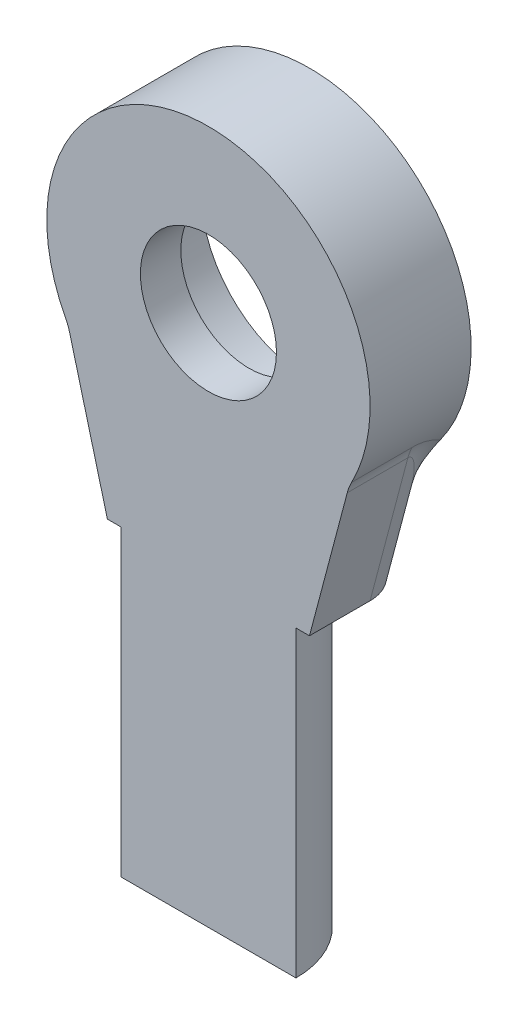
ISO-10303-21;
HEADER;
FILE_DESCRIPTION(('STEP AP214'),'2;1');
FILE_NAME('part.step','',(''),(''),'','','');
FILE_SCHEMA(('AUTOMOTIVE_DESIGN { 1 0 10303 214 1 1 1 1 }'));
ENDSEC;
DATA;
#1=APPLICATION_CONTEXT('core data for automotive mechanical design processes');
#2=APPLICATION_PROTOCOL_DEFINITION('international standard','automotive_design',2000,#1);
#3=PRODUCT_CONTEXT('',#1,'mechanical');
#4=PRODUCT('Part','Part','',(#3));
#5=PRODUCT_RELATED_PRODUCT_CATEGORY('part','',(#4));
#6=PRODUCT_DEFINITION_FORMATION('','',#4);
#7=PRODUCT_DEFINITION_CONTEXT('part definition',#1,'design');
#8=PRODUCT_DEFINITION('design','',#6,#7);
#9=PRODUCT_DEFINITION_SHAPE('','',#8);
#10=(LENGTH_UNIT() NAMED_UNIT(*) SI_UNIT(.MILLI.,.METRE.));
#11=(NAMED_UNIT(*) PLANE_ANGLE_UNIT() SI_UNIT($,.RADIAN.));
#12=(NAMED_UNIT(*) SI_UNIT($,.STERADIAN.) SOLID_ANGLE_UNIT());
#13=UNCERTAINTY_MEASURE_WITH_UNIT(LENGTH_MEASURE(1.E-05),#10,'distance_accuracy_value','');
#14=(GEOMETRIC_REPRESENTATION_CONTEXT(3) GLOBAL_UNCERTAINTY_ASSIGNED_CONTEXT((#13)) GLOBAL_UNIT_ASSIGNED_CONTEXT((#10,
#11,#12)) REPRESENTATION_CONTEXT('',''));
#15=CARTESIAN_POINT('',(0.,0.,0.));
#16=DIRECTION('',(0.,0.,1.));
#17=DIRECTION('',(1.,0.,0.));
#18=AXIS2_PLACEMENT_3D('',#15,#16,#17);
#19=CARTESIAN_POINT('',(448.632229886668,1441.90594011253,-6.));
#20=DIRECTION('',(0.,0.,-1.));
#21=DIRECTION('',(-1.,0.,0.));
#22=AXIS2_PLACEMENT_3D('',#19,#20,#21);
#23=CYLINDRICAL_SURFACE('',#22,8.05000000000052);
#24=CARTESIAN_POINT('',(448.632229886668,1441.90594011253,-6.));
#25=DIRECTION('',(0.,0.,-1.));
#26=DIRECTION('',(-1.,0.,0.));
#27=AXIS2_PLACEMENT_3D('',#24,#25,#26);
#28=CIRCLE('',#27,8.05000000000052);
#29=CARTESIAN_POINT('',(440.582229886668,1441.90594011253,-6.));
#30=VERTEX_POINT('',#29);
#31=EDGE_CURVE('E91',#30,#30,#28,.T.);
#32=ORIENTED_EDGE('',*,*,#31,.F.);
#33=EDGE_LOOP('',(#32));
#34=FACE_BOUND('',#33,.T.);
#35=CARTESIAN_POINT('',(448.632229886668,1441.90594011253,-10.5));
#36=DIRECTION('',(0.,0.,-1.));
#37=DIRECTION('',(-1.,0.,0.));
#38=AXIS2_PLACEMENT_3D('',#35,#36,#37);
#39=CIRCLE('',#38,8.05000000000052);
#40=CARTESIAN_POINT('',(440.582229886668,1441.90594011253,-10.5));
#41=VERTEX_POINT('',#40);
#42=EDGE_CURVE('E139',#41,#41,#39,.F.);
#43=ORIENTED_EDGE('',*,*,#42,.F.);
#44=EDGE_LOOP('',(#43));
#45=FACE_BOUND('',#44,.T.);
#46=ADVANCED_FACE('F16',(#34,#45),#23,.F.);
#47=CARTESIAN_POINT('',(453.028905405185,1424.90594011253,-7.49999999999988));
#48=DIRECTION('',(0.255892560316815,0.966705227861371,0.));
#49=DIRECTION('',(-0.966705227861371,0.255892560316815,0.));
#50=AXIS2_PLACEMENT_3D('',#47,#48,#49);
#51=CYLINDRICAL_SURFACE('',#50,3.00000000000003);
#52=CARTESIAN_POINT('',(453.028905405185,1424.90594011253,-7.49999999999988));
#53=DIRECTION('',(0.,-1.,0.));
#54=DIRECTION('',(1.,0.,-2.79611724719762E-13));
#55=AXIS2_PLACEMENT_3D('',#52,#53,#54);
#56=ELLIPSE('',#55,3.10332448148325,3.00000000000003);
#57=CARTESIAN_POINT('',(453.028905405185,1424.90594011253,-10.5));
#58=VERTEX_POINT('',#57);
#59=CARTESIAN_POINT('',(456.132229886668,1424.90594011253,-7.5000000000002));
#60=VERTEX_POINT('',#59);
#61=EDGE_CURVE('E92',#58,#60,#56,.T.);
#62=ORIENTED_EDGE('',*,*,#61,.F.);
#63=DIRECTION('',(-0.255892560317666,-0.966705227861146,0.));
#64=VECTOR('',#63,1.);
#65=CARTESIAN_POINT('',(453.493858936923,1426.66243123242,-10.5));
#66=LINE('',#65,#64);
#67=CARTESIAN_POINT('',(453.493858936923,1426.66243123242,-10.5));
#68=VERTEX_POINT('',#67);
#69=EDGE_CURVE('E142',#68,#58,#66,.T.);
#70=ORIENTED_EDGE('',*,*,#69,.F.);
#71=CARTESIAN_POINT('',(458.937208448978,1435.50252579237,-7.50000000000044));
#72=CARTESIAN_POINT('',(458.937208448978,1435.50252579237,-7.57651101578004));
#73=CARTESIAN_POINT('',(458.915314342587,1435.44347128536,-7.72910936543949));
#74=CARTESIAN_POINT('',(458.805179282937,1435.15088177023,-8.00502900571239));
#75=CARTESIAN_POINT('',(458.599112538425,1434.62252174929,-8.29806035858928));
#76=CARTESIAN_POINT('',(458.305288655624,1433.91631812947,-8.6050636014635));
#77=CARTESIAN_POINT('',(457.868090404801,1432.93346857883,-8.9788104154463));
#78=CARTESIAN_POINT('',(457.256285892257,1431.69228990232,-9.39636612313964));
#79=CARTESIAN_POINT('',(456.43165446515,1430.24828185882,-9.83085979614496));
#80=CARTESIAN_POINT('',(455.521222224728,1428.88896615841,-10.1854207713805));
#81=CARTESIAN_POINT('',(454.535311734702,1427.66148625712,-10.4333627874454));
#82=CARTESIAN_POINT('',(453.841561273141,1426.96746358986,-10.5));
#83=CARTESIAN_POINT('',(453.493858936923,1426.66243123242,-10.5));
#84=B_SPLINE_CURVE_WITH_KNOTS('',3,(#71,#72,#73,#74,#75,#76,#77,#78,#79,#80,#81,#82,#83),
.UNSPECIFIED.,.F.,.F.,(4,1,1,1,1,1,1,1,1,1,4),(52.8653565728212,53.4009336832801,
53.936510793739,55.0076650146569,56.0788192355747,57.1499734564925,59.2922818983282,
61.4345903401639,63.5768987819995,65.7192072238352,67.8615156656709),.UNSPECIFIED.);
#85=CARTESIAN_POINT('',(458.937208448979,1435.50252579237,-7.50000000000035));
#86=VERTEX_POINT('',#85);
#87=EDGE_CURVE('E149',#86,#68,#84,.T.);
#88=ORIENTED_EDGE('',*,*,#87,.F.);
#89=DIRECTION('',(0.255892560316388,0.966705227861484,0.));
#90=VECTOR('',#89,1.);
#91=CARTESIAN_POINT('',(457.534719167824,1430.20423295245,-7.50000000000047));
#92=LINE('',#91,#90);
#93=EDGE_CURVE('E102',#60,#86,#92,.T.);
#94=ORIENTED_EDGE('',*,*,#93,.F.);
#95=EDGE_LOOP('',(#62,#70,#88,#94));
#96=FACE_BOUND('',#95,.T.);
#97=ADVANCED_FACE('F370',(#96),#51,.T.);
#98=CARTESIAN_POINT('',(462.804029360512,1434.47895555107,-7.50000000000046));
#99=DIRECTION('',(0.,0.,1.));
#100=DIRECTION('',(1.,0.,0.));
#101=AXIS2_PLACEMENT_3D('',#98,#99,#100);
#102=CYLINDRICAL_SURFACE('',#101,4.00000000009279);
#103=CARTESIAN_POINT('',(462.804029360512,1434.47895555107,-7.50000000000044));
#104=DIRECTION('',(0.,0.,1.));
#105=DIRECTION('',(1.,0.,0.));
#106=AXIS2_PLACEMENT_3D('',#103,#104,#105);
#107=CIRCLE('',#106,4.00000000009279);
#108=CARTESIAN_POINT('',(459.261079491986,1436.33570169146,-7.50000000000064));
#109=VERTEX_POINT('',#108);
#110=EDGE_CURVE('E147',#109,#86,#107,.T.);
#111=ORIENTED_EDGE('',*,*,#110,.F.);
#112=DIRECTION('',(0.,0.,-1.));
#113=VECTOR('',#112,1.);
#114=CARTESIAN_POINT('',(459.261079491986,1436.33570169146,-6.7875));
#115=LINE('',#114,#113);
#116=CARTESIAN_POINT('',(459.261079491988,1436.33570169146,-3.));
#117=VERTEX_POINT('',#116);
#118=EDGE_CURVE('E266',#117,#109,#115,.T.);
#119=ORIENTED_EDGE('',*,*,#118,.F.);
#120=CARTESIAN_POINT('',(462.804029360512,1434.47895555107,-3.));
#121=DIRECTION('',(0.,0.,1.));
#122=DIRECTION('',(1.,0.,0.));
#123=AXIS2_PLACEMENT_3D('',#120,#121,#122);
#124=CIRCLE('',#123,4.00000000009279);
#125=CARTESIAN_POINT('',(458.937208448977,1435.50252579236,-3.));
#126=VERTEX_POINT('',#125);
#127=EDGE_CURVE('E20',#117,#126,#124,.T.);
#128=ORIENTED_EDGE('',*,*,#127,.T.);
#129=DIRECTION('',(-2.22044604925008E-13,0.,1.));
#130=VECTOR('',#129,1.);
#131=CARTESIAN_POINT('',(458.937208448979,1435.50252579237,-5.25000000000023));
#132=LINE('',#131,#130);
#133=EDGE_CURVE('E105',#86,#126,#132,.T.);
#134=ORIENTED_EDGE('',*,*,#133,.F.);
#135=EDGE_LOOP('',(#111,#119,#128,#134));
#136=FACE_BOUND('',#135,.T.);
#137=ADVANCED_FACE('F196',(#136),#102,.F.);
#138=CARTESIAN_POINT('',(459.261079491985,1436.33570169146,-7.50000000000101));
#139=CARTESIAN_POINT('',(459.261079491985,1436.33570169146,-7.6785257034887));
#140=CARTESIAN_POINT('',(459.238806925253,1436.29295986657,-8.03458851936219));
#141=CARTESIAN_POINT('',(459.125660976251,1436.08160307988,-8.67840101333092));
#142=CARTESIAN_POINT('',(458.909239462533,1435.70171080235,-9.36214083671051));
#143=CARTESIAN_POINT('',(458.588983029128,1435.19849916665,-10.0784817367493));
#144=CARTESIAN_POINT('',(458.095644393189,1434.50515493104,-10.9505576360434));
#145=CARTESIAN_POINT('',(457.372081759395,1433.64434101908,-11.9248542873265));
#146=CARTESIAN_POINT('',(456.340182588075,1432.67077117495,-12.9386728576728));
#147=CARTESIAN_POINT('',(455.142799745186,1431.78749110444,-13.7659817998884));
#148=CARTESIAN_POINT('',(453.785659782538,1431.03039188013,-14.3445131707061));
#149=CARTESIAN_POINT('',(452.788706194747,1430.63604448776,-14.5));
#150=CARTESIAN_POINT('',(452.27845167436,1430.47330845245,-14.5));
#151=CARTESIAN_POINT('',(459.241279054424,1436.2979194895,-7.50000000000098));
#152=CARTESIAN_POINT('',(459.241279054424,1436.2979194895,-7.67362701770432));
#153=CARTESIAN_POINT('',(459.218527303584,1436.25463205489,-8.01991815393205));
#154=CARTESIAN_POINT('',(459.102959453249,1436.04062899086,-8.6459174031665));
#155=CARTESIAN_POINT('',(458.881947188455,1435.65629704721,-9.31031623135618));
#156=CARTESIAN_POINT('',(458.555135551572,1435.14808448099,-10.0055083434893));
#157=CARTESIAN_POINT('',(458.05234291392,1434.4493487836,-10.8503635647305));
#158=CARTESIAN_POINT('',(457.316763874983,1433.58538495557,-11.790946638831));
#159=CARTESIAN_POINT('',(456.274038700857,1432.61564100248,-12.7624631699717));
#160=CARTESIAN_POINT('',(455.075323489833,1431.74484231416,-13.545320583899));
#161=CARTESIAN_POINT('',(453.734838722947,1431.00811670544,-14.0792009561619));
#162=CARTESIAN_POINT('',(452.768031054394,1430.62949966598,-14.2096053694294));
#163=CARTESIAN_POINT('',(452.27845167436,1430.47330845245,-14.2008006996581));
#164=CARTESIAN_POINT('',(459.18369074823,1436.18362274734,-7.5000000000009));
#165=CARTESIAN_POINT('',(459.18369074823,1436.18362274734,-7.65893095998917));
#166=CARTESIAN_POINT('',(459.159713630999,1436.13856142434,-7.97590904947657));
#167=CARTESIAN_POINT('',(459.037941758815,1435.9159746504,-8.54847060653616));
#168=CARTESIAN_POINT('',(458.805260848445,1435.51688498167,-9.1548541392806));
#169=CARTESIAN_POINT('',(458.461962941206,1434.99111893327,-9.78660881744868));
#170=CARTESIAN_POINT('',(457.935633714869,1434.27169756931,-10.5498046266487));
#171=CARTESIAN_POINT('',(457.17081809454,1433.3899839524,-11.3892700924674));
#172=CARTESIAN_POINT('',(456.10346395943,1432.41755460738,-12.2338838405543));
#173=CARTESIAN_POINT('',(454.906673953089,1431.56539249056,-12.8834002597003));
#174=CARTESIAN_POINT('',(453.617982283633,1430.86777948113,-13.2832947815088));
#175=CARTESIAN_POINT('',(452.738948483568,1430.52100552055,-13.3384311695949));
#176=CARTESIAN_POINT('',(452.30893535147,1430.37772769178,-13.3031780418912));
#177=CARTESIAN_POINT('',(459.096925720413,1435.98866836809,-7.50000000000077));
#178=CARTESIAN_POINT('',(459.096925720413,1435.98866836809,-7.63447513793553));
#179=CARTESIAN_POINT('',(459.071942088017,1435.94013192873,-7.9026740737783));
#180=CARTESIAN_POINT('',(458.945213525226,1435.70035097295,-8.38644400580358));
#181=CARTESIAN_POINT('',(458.703725718513,1435.27043314292,-8.89681480489716));
#182=CARTESIAN_POINT('',(458.34930824006,1434.70409346349,-9.42438216910841));
#183=CARTESIAN_POINT('',(457.809212372483,1433.92932934547,-10.0547648414138));
#184=CARTESIAN_POINT('',(457.032104952352,1432.98051587451,-10.7325702098317));
#185=CARTESIAN_POINT('',(455.968175631682,1431.93607276744,-11.380146116023));
#186=CARTESIAN_POINT('',(454.809344005836,1431.02337460336,-11.8297949720825));
#187=CARTESIAN_POINT('',(453.617171092271,1430.27745055063,-12.0371481416556));
#188=CARTESIAN_POINT('',(452.862035755585,1429.90281795514,-11.9901287285702));
#189=CARTESIAN_POINT('',(452.511065173195,1429.74395499943,-11.9209023061551));
#190=CARTESIAN_POINT('',(459.007979642307,1435.74854433101,-7.50000000000061));
#191=CARTESIAN_POINT('',(459.007979642307,1435.74854433101,-7.60530843814866));
#192=CARTESIAN_POINT('',(458.983512033903,1435.69509039586,-7.8153329029188));
#193=CARTESIAN_POINT('',(458.859754767646,1435.43071332177,-8.19384849654414));
#194=CARTESIAN_POINT('',(458.625430845801,1434.95530830947,-8.59223958983257));
#195=CARTESIAN_POINT('',(458.285131660067,1434.3252637466,-9.0021148433374));
#196=CARTESIAN_POINT('',(457.771528188261,1433.45705191451,-9.48869805797009));
#197=CARTESIAN_POINT('',(457.042039416362,1432.37947124065,-10.0048261350455));
#198=CARTESIAN_POINT('',(456.05864255289,1431.16287267853,-10.4830869459269));
#199=CARTESIAN_POINT('',(455.002266864215,1430.06029286143,-10.7947777223088));
#200=CARTESIAN_POINT('',(453.92962435359,1429.10996819953,-10.908256592212));
#201=CARTESIAN_POINT('',(453.258625706263,1428.59679499299,-10.8398812780348));
#202=CARTESIAN_POINT('',(452.948490390935,1428.37241983661,-10.7732345861429));
#203=CARTESIAN_POINT('',(458.959039261722,1435.58499775162,-7.5000000000005));
#204=CARTESIAN_POINT('',(458.959039261722,1435.58499775162,-7.58606373038768));
#205=CARTESIAN_POINT('',(458.93608838124,1435.52786417434,-7.75771642275943));
#206=CARTESIAN_POINT('',(458.820387455675,1435.24495161224,-8.06750767899078));
#207=CARTESIAN_POINT('',(458.602885051763,1434.73478252942,-8.39485663562652));
#208=CARTESIAN_POINT('',(458.290531262485,1434.0547758529,-8.73434389344203));
#209=CARTESIAN_POINT('',(457.823303346972,1433.11134838935,-9.14192808479234));
#210=CARTESIAN_POINT('',(457.16619528259,1431.92632786601,-9.58484600163962));
#211=CARTESIAN_POINT('',(456.28288292962,1430.55965441085,-10.0195099217717));
#212=CARTESIAN_POINT('',(455.322442631238,1429.2863009091,-10.3402062954241));
#213=CARTESIAN_POINT('',(454.314136189018,1428.14949247183,-10.5203025150832));
#214=CARTESIAN_POINT('',(453.63959977547,1427.51270132203,-10.5277307398779));
#215=CARTESIAN_POINT('',(453.312034435628,1427.23253713138,-10.5000000000001));
#216=CARTESIAN_POINT('',(458.937208448978,1435.50252579237,-7.50000000000044));
#217=CARTESIAN_POINT('',(458.937208448978,1435.50252579237,-7.57651101578004));
#218=CARTESIAN_POINT('',(458.915314342587,1435.44347128536,-7.72910936543949));
#219=CARTESIAN_POINT('',(458.805179282937,1435.15088177023,-8.00502900571239));
#220=CARTESIAN_POINT('',(458.599112538425,1434.62252174929,-8.29806035858928));
#221=CARTESIAN_POINT('',(458.305288655624,1433.91631812947,-8.6050636014635));
#222=CARTESIAN_POINT('',(457.868090404801,1432.93346857883,-8.9788104154463));
#223=CARTESIAN_POINT('',(457.256285892257,1431.69228990232,-9.39636612313964));
#224=CARTESIAN_POINT('',(456.43165446515,1430.24828185882,-9.83085979614496));
#225=CARTESIAN_POINT('',(455.521222224728,1428.88896615841,-10.1854207713805));
#226=CARTESIAN_POINT('',(454.535311734702,1427.66148625712,-10.4333627874454));
#227=CARTESIAN_POINT('',(453.841561273141,1426.96746358986,-10.5));
#228=CARTESIAN_POINT('',(453.493858936923,1426.66243123242,-10.5));
#229=B_SPLINE_SURFACE_WITH_KNOTS('',3,3,((#138,#139,#140,#141,#142,#143,#144,#145,#146,#147,
#148,#149,#150),(#151,#152,#153,#154,#155,#156,#157,#158,#159,#160,#161,#162,#163),(#164,#165,
#166,#167,#168,#169,#170,#171,#172,#173,#174,#175,#176),(#177,#178,#179,#180,#181,#182,#183,
#184,#185,#186,#187,#188,#189),(#190,#191,#192,#193,#194,#195,#196,#197,#198,#199,#200,#201,
#202),(#203,#204,#205,#206,#207,#208,#209,#210,#211,#212,#213,#214,#215),(#216,#217,#218,#219,
#220,#221,#222,#223,#224,#225,#226,#227,#228)),.UNSPECIFIED.,.F.,.F.,.F.,(4,1,1,1,4),(4,1,1,1,1,
1,1,1,1,1,4),(0.,0.142857142857143,0.428571428571429,0.714285714285714,1.),(52.8653565728212,
53.4009336832801,53.936510793739,55.0076650146569,56.0788192355747,57.1499734564925,
59.2922818983282,61.4345903401639,63.5768987819995,65.7192072238352,67.8615156656709),.UNSPECIFIED.);
#230=CARTESIAN_POINT('',(453.493858936923,1426.66243123242,-10.5));
#231=CARTESIAN_POINT('',(453.522105346006,1426.70608186273,-10.4999995182953));
#232=CARTESIAN_POINT('',(453.550180993919,1426.74984251797,-10.4999959425049));
#233=CARTESIAN_POINT('',(453.642446531642,1426.89477844442,-10.4999805900697));
#234=CARTESIAN_POINT('',(453.705968447676,1426.99637947361,-10.4999642004691));
#235=CARTESIAN_POINT('',(453.867975377029,1427.25909280952,-10.4999711568323));
#236=CARTESIAN_POINT('',(453.965526689691,1427.42077874719,-10.500022824165));
#237=CARTESIAN_POINT('',(454.13492556993,1427.70525012403,-10.5000955077368));
#238=CARTESIAN_POINT('',(454.207179001877,1427.82779526526,-10.500120940664));
#239=CARTESIAN_POINT('',(454.342336630919,1428.0592543227,-10.5001647609599));
#240=CARTESIAN_POINT('',(454.405353935134,1428.16810216685,-10.500183623258));
#241=CARTESIAN_POINT('',(454.522431308104,1428.37156968087,-10.5001628664911));
#242=CARTESIAN_POINT('',(454.576563525734,1428.46614789577,-10.5001307221305));
#243=CARTESIAN_POINT('',(454.703335392347,1428.68903542819,-10.5001158087678));
#244=CARTESIAN_POINT('',(454.775762329362,1428.81746573401,-10.500154476476));
#245=CARTESIAN_POINT('',(454.917038815174,1429.06921796472,-10.5002704771452));
#246=CARTESIAN_POINT('',(454.985910648348,1429.19252742669,-10.5003461145386));
#247=CARTESIAN_POINT('',(455.120223209436,1429.43362919679,-10.5004644767362));
#248=CARTESIAN_POINT('',(455.185676189603,1429.55141468054,-10.5005085540911));
#249=CARTESIAN_POINT('',(455.313199276394,1429.78118263594,-10.5005189823216));
#250=CARTESIAN_POINT('',(455.375275408595,1429.89316176652,-10.5004890973613));
#251=CARTESIAN_POINT('',(455.496076500255,1430.11110598904,-10.5003654469334));
#252=CARTESIAN_POINT('',(455.554802170819,1430.2170706892,-10.5002752028483));
#253=CARTESIAN_POINT('',(455.668858064007,1430.42285845231,-10.5001162372076));
#254=CARTESIAN_POINT('',(455.724187920712,1430.52268171724,-10.5000465717409));
#255=CARTESIAN_POINT('',(455.854117902175,1430.75702061413,-10.5000117206911));
#256=CARTESIAN_POINT('',(455.928728954618,1430.89153021195,-10.5000912867856));
#257=CARTESIAN_POINT('',(456.075155995471,1431.15466496488,-10.5002955935951));
#258=CARTESIAN_POINT('',(456.146956833607,1431.28329854165,-10.500418282819));
#259=CARTESIAN_POINT('',(456.287789169762,1431.53437567653,-10.5006075961207));
#260=CARTESIAN_POINT('',(456.356796715375,1431.65683265217,-10.5006765326928));
#261=CARTESIAN_POINT('',(456.492048551229,1431.89534734466,-10.500697029504));
#262=CARTESIAN_POINT('',(456.55826134235,1432.01142290685,-10.5006542089961));
#263=CARTESIAN_POINT('',(456.687876178512,1432.2370542359,-10.500471312623));
#264=CARTESIAN_POINT('',(456.751242108572,1432.34663074157,-10.5003364895545));
#265=CARTESIAN_POINT('',(456.875082121231,1432.55921949561,-10.5001091102972));
#266=CARTESIAN_POINT('',(456.935518119129,1432.66225392638,-10.5000146015409));
#267=CARTESIAN_POINT('',(457.071177017285,1432.89171489952,-10.4999665909133));
#268=CARTESIAN_POINT('',(457.146583316979,1433.01803327061,-10.5000508092148));
#269=CARTESIAN_POINT('',(457.294493083244,1433.26263399698,-10.5001353965373));
#270=CARTESIAN_POINT('',(457.366917228597,1433.38096423409,-10.5001402685713));
#271=CARTESIAN_POINT('',(457.508775309054,1433.60948984633,-10.5000724110858));
#272=CARTESIAN_POINT('',(457.578121036196,1433.71973993182,-10.5000044118589));
#273=CARTESIAN_POINT('',(457.727248686267,1433.95326945671,-10.5000118490129));
#274=CARTESIAN_POINT('',(457.807234466366,1434.07641901765,-10.5001066667763));
#275=CARTESIAN_POINT('',(457.964907855177,1434.31419882832,-10.5001808127569));
#276=CARTESIAN_POINT('',(458.042466356987,1434.42891438057,-10.5001664193267));
#277=CARTESIAN_POINT('',(458.195266473235,1434.64972714443,-10.5000977692696));
#278=CARTESIAN_POINT('',(458.270363027027,1434.75592487171,-10.5000459849736));
#279=CARTESIAN_POINT('',(458.346709872353,1434.86122859093,-10.5000000097309));
#280=B_SPLINE_CURVE_WITH_KNOTS('',3,(#230,#231,#232,#233,#234,#235,#236,#237,#238,#239,#240,
#241,#242,#243,#244,#245,#246,#247,#248,#249,#250,#251,#252,#253,#254,#255,#256,#257,#258,#259,
#260,#261,#262,#263,#264,#265,#266,#267,#268,#269,#270,#271,#272,#273,#274,#275,#276,#277,#278,
#279),.UNSPECIFIED.,.F.,.F.,(4,2,2,2,2,2,2,2,2,2,2,2,2,2,2,2,2,2,2,2,2,2,2,2,4),(0.,
0.155977048153093,0.5154349915053,1.08191622707472,1.50869227849864,1.88601060564265,
2.21293144289384,2.6552631927427,3.07898095006146,3.48323021096299,3.86733298049842,
4.23078183494849,4.57317741670573,5.03462796122675,5.47657481521467,5.89826010760816,
6.29915574533523,6.67889064296059,7.03724240724763,7.4785761535931,7.89477034587601,
8.28549709982398,8.72601218061923,9.14140312498363,9.53158380776322),.UNSPECIFIED.);
#281=CARTESIAN_POINT('',(458.346782337597,1434.86128814228,-10.4999672292394));
#282=VERTEX_POINT('',#281);
#283=EDGE_CURVE('E144',#282,#68,#280,.F.);
#284=CARTESIAN_POINT('',(452.27845167436,1430.47330845245,-14.5));
#285=CARTESIAN_POINT('',(452.788706194747,1430.63604448776,-14.5));
#286=CARTESIAN_POINT('',(453.785659782538,1431.03039188013,-14.3445131707061));
#287=CARTESIAN_POINT('',(455.142799745186,1431.78749110444,-13.7659817998884));
#288=CARTESIAN_POINT('',(456.340182588075,1432.67077117495,-12.9386728576728));
#289=CARTESIAN_POINT('',(457.372081759395,1433.64434101908,-11.9248542873265));
#290=CARTESIAN_POINT('',(458.095644393189,1434.50515493104,-10.9505576360434));
#291=CARTESIAN_POINT('',(458.588983029128,1435.19849916665,-10.0784817367493));
#292=CARTESIAN_POINT('',(458.909239462533,1435.70171080235,-9.36214083671051));
#293=CARTESIAN_POINT('',(459.125660976251,1436.08160307988,-8.67840101333092));
#294=CARTESIAN_POINT('',(459.238806925253,1436.29295986657,-8.03458851936219));
#295=CARTESIAN_POINT('',(459.261079491985,1436.33570169146,-7.6785257034887));
#296=CARTESIAN_POINT('',(459.261079491985,1436.33570169146,-7.50000000000101));
#297=B_SPLINE_CURVE_WITH_KNOTS('',3,(#284,#285,#286,#287,#288,#289,#290,#291,#292,#293,#294,
#295,#296),.UNSPECIFIED.,.F.,.F.,(4,1,1,1,1,1,1,1,1,1,4),(52.8653565728212,55.0076650146569,
57.1499734564926,59.2922818983282,61.4345903401639,63.5768987819996,64.6480530029174,
65.7192072238352,66.7903614447531,67.325938555212,67.8615156656709),.UNSPECIFIED.);
#298=EDGE_CURVE('E124',#109,#282,#297,.F.);
#299=ORIENTED_EDGE('',*,*,#283,.F.);
#300=ORIENTED_EDGE('',*,*,#298,.F.);
#301=ORIENTED_EDGE('',*,*,#110,.T.);
#302=ORIENTED_EDGE('',*,*,#87,.T.);
#303=EDGE_LOOP('',(#299,#300,#301,#302));
#304=FACE_BOUND('',#303,.T.);
#305=ADVANCED_FACE('F194',(#304),#229,.T.);
#306=CARTESIAN_POINT('',(464.686044414996,1424.90594011253,-10.5));
#307=DIRECTION('',(0.,0.,-1.));
#308=DIRECTION('',(-1.,0.,0.));
#309=AXIS2_PLACEMENT_3D('',#306,#307,#308);
#310=PLANE('',#309);
#311=ORIENTED_EDGE('',*,*,#42,.T.);
#312=EDGE_LOOP('',(#311));
#313=FACE_BOUND('',#312,.T.);
#314=DIRECTION('',(0.255892560316351,-0.966705227861494,0.));
#315=VECTOR('',#314,1.);
#316=CARTESIAN_POINT('',(442.731460688046,1430.58807179292,-10.5000000000001));
#317=LINE('',#316,#315);
#318=CARTESIAN_POINT('',(443.770600836414,1426.66243123242,-10.5));
#319=VERTEX_POINT('',#318);
#320=CARTESIAN_POINT('',(444.235554368152,1424.90594011253,-10.5000000000002));
#321=VERTEX_POINT('',#320);
#322=EDGE_CURVE('E277',#319,#321,#317,.T.);
#323=ORIENTED_EDGE('',*,*,#322,.F.);
#324=CARTESIAN_POINT('',(438.917749908672,1434.86122859651,-10.5000000097366));
#325=CARTESIAN_POINT('',(438.994093173196,1434.75592963277,-10.5000458426316));
#326=CARTESIAN_POINT('',(439.069186424741,1434.64973685114,-10.5000985942719));
#327=CARTESIAN_POINT('',(439.221983445105,1434.42892943899,-10.500169241312));
#328=CARTESIAN_POINT('',(439.299542060374,1434.31421422809,-10.5001846624096));
#329=CARTESIAN_POINT('',(439.457218930857,1434.07642958867,-10.5001098568464));
#330=CARTESIAN_POINT('',(439.537207960026,1433.95327477859,-10.500013178896));
#331=CARTESIAN_POINT('',(439.68633107513,1433.71975152927,-10.5000032353528));
#332=CARTESIAN_POINT('',(439.755669269171,1433.60951312729,-10.5000704536233));
#333=CARTESIAN_POINT('',(439.897520255746,1433.38099986138,-10.5001390230407));
#334=CARTESIAN_POINT('',(439.969944739544,1433.26267022424,-10.5001357871288));
#335=CARTESIAN_POINT('',(440.117862268656,1433.01805795299,-10.500052369579));
#336=CARTESIAN_POINT('',(440.193275821453,1432.89172733313,-10.4999675439133));
#337=CARTESIAN_POINT('',(440.328937055961,1432.66226110815,-10.5000138290005));
#338=CARTESIAN_POINT('',(440.389368366994,1432.55923380886,-10.5001073119846));
#339=CARTESIAN_POINT('',(440.513201132468,1432.34665681236,-10.5003338432522));
#340=CARTESIAN_POINT('',(440.576564512694,1432.23708493901,-10.5004689204637));
#341=CARTESIAN_POINT('',(440.706176120873,1432.01146005593,-10.5006525314043));
#342=CARTESIAN_POINT('',(440.772388224934,1431.89538630214,-10.5006958200974));
#343=CARTESIAN_POINT('',(440.907640496037,1431.6568722268,-10.5006762857707));
#344=CARTESIAN_POINT('',(440.976649150812,1431.53441405233,-10.5006078406146));
#345=CARTESIAN_POINT('',(441.117485373573,1431.28333130907,-10.5004192454918));
#346=CARTESIAN_POINT('',(441.189288970729,1431.15469331233,-10.5002967680441));
#347=CARTESIAN_POINT('',(441.335722820807,1430.89154618259,-10.5000922168956));
#348=CARTESIAN_POINT('',(441.410337891857,1430.75702861041,-10.5000121660116));
#349=CARTESIAN_POINT('',(441.540267733788,1430.52268851147,-10.5000462513434));
#350=CARTESIAN_POINT('',(441.595593456347,1430.42287203222,-10.5001156010853));
#351=CARTESIAN_POINT('',(441.709642916511,1430.2170952635,-10.5002743152786));
#352=CARTESIAN_POINT('',(441.768366308233,1430.11113478318,-10.5003646485662));
#353=CARTESIAN_POINT('',(441.889164468017,1429.89319626929,-10.5004885461234));
#354=CARTESIAN_POINT('',(441.951239952277,1429.78121863031,-10.5005185907192));
#355=CARTESIAN_POINT('',(442.07876330665,1429.55145086805,-10.5005084695106));
#356=CARTESIAN_POINT('',(442.144217205581,1429.43366408762,-10.5004645365791));
#357=CARTESIAN_POINT('',(442.278533101138,1429.19255688697,-10.5003463736208));
#358=CARTESIAN_POINT('',(442.34740735263,1429.06924329263,-10.500270785787));
#359=CARTESIAN_POINT('',(442.488689945183,1428.81747984169,-10.5001546990667));
#360=CARTESIAN_POINT('',(442.561120568466,1428.68904244677,-10.5001158884003));
#361=CARTESIAN_POINT('',(442.687890574587,1428.46615762829,-10.5001306715086));
#362=CARTESIAN_POINT('',(442.742017108434,1428.37158913909,-10.5001627892909));
#363=CARTESIAN_POINT('',(442.859088797321,1428.16813130574,-10.5001835644578));
#364=CARTESIAN_POINT('',(442.922106169912,1428.05928345607,-10.500164752414));
#365=CARTESIAN_POINT('',(443.05726944048,1427.82781464803,-10.5001209738882));
#366=CARTESIAN_POINT('',(443.129528508304,1427.70525979842,-10.5000955238054));
#367=CARTESIAN_POINT('',(443.298940962489,1427.42076536875,-10.5000228042581));
#368=CARTESIAN_POINT('',(443.396500264453,1427.25906611613,-10.4999711193764));
#369=CARTESIAN_POINT('',(443.55851563376,1426.99633985638,-10.4999641781219));
#370=CARTESIAN_POINT('',(443.622037675713,1426.89473901785,-10.4999805812863));
#371=CARTESIAN_POINT('',(443.714295304875,1426.74981645958,-10.4999959413913));
#372=CARTESIAN_POINT('',(443.742362728395,1426.70606885801,-10.4999995178111));
#373=CARTESIAN_POINT('',(443.770600836413,1426.66243123242,-10.5));
#374=B_SPLINE_CURVE_WITH_KNOTS('',3,(#324,#325,#326,#327,#328,#329,#330,#331,#332,#333,#334,
#335,#336,#337,#338,#339,#340,#341,#342,#343,#344,#345,#346,#347,#348,#349,#350,#351,#352,#353,
#354,#355,#356,#357,#358,#359,#360,#361,#362,#363,#364,#365,#366,#367,#368,#369,#370,#371,#372,
#373),.UNSPECIFIED.,.F.,.F.,(4,2,2,2,2,2,2,2,2,2,2,2,2,2,2,2,2,2,2,2,2,2,2,2,4),(0.,
0.390162847436727,0.805553132832183,1.24608671987139,1.6367717807496,2.05296496964822,
2.49434141057552,2.85266760656375,3.23238664823618,3.63327655316574,4.05496661161059,
4.49692907604288,4.95840638882301,5.30077815255734,5.66421262052315,6.04831053406528,
6.45256453376889,6.8762966531477,7.31865236034176,7.64553940401906,8.02285784818816,
8.44966757689143,9.01619538882826,9.37565304388608,9.53158380868827),.UNSPECIFIED.);
#375=CARTESIAN_POINT('',(438.917716895401,1434.86123491005,-10.5000322658942));
#376=VERTEX_POINT('',#375);
#377=EDGE_CURVE('E138',#376,#319,#374,.T.);
#378=ORIENTED_EDGE('',*,*,#377,.F.);
#379=CARTESIAN_POINT('',(448.63222988667,1441.90594011253,-10.5));
#380=DIRECTION('',(0.,0.,1.));
#381=DIRECTION('',(1.,0.,0.));
#382=AXIS2_PLACEMENT_3D('',#379,#380,#381);
#383=CIRCLE('',#382,12.0000000000012);
#384=EDGE_CURVE('E120',#282,#376,#383,.T.);
#385=ORIENTED_EDGE('',*,*,#384,.F.);
#386=ORIENTED_EDGE('',*,*,#283,.T.);
#387=ORIENTED_EDGE('',*,*,#69,.T.);
#388=DIRECTION('',(1.,0.,0.));
#389=VECTOR('',#388,1.);
#390=CARTESIAN_POINT('',(448.632229886668,1424.90594011253,-10.5));
#391=LINE('',#390,#389);
#392=EDGE_CURVE('E130',#321,#58,#391,.T.);
#393=ORIENTED_EDGE('',*,*,#392,.F.);
#394=EDGE_LOOP('',(#323,#378,#385,#386,#387,#393));
#395=FACE_BOUND('',#394,.T.);
#396=ADVANCED_FACE('F166',(#313,#395),#310,.T.);
#397=CARTESIAN_POINT('',(438.327251324356,1435.50252579237,-7.50000000000045));
#398=CARTESIAN_POINT('',(438.327251324356,1435.50252579237,-7.57651101578038));
#399=CARTESIAN_POINT('',(438.349145428735,1435.44347129088,-7.7291093640935));
#400=CARTESIAN_POINT('',(438.459280485726,1435.1508817833,-8.00502900336943));
#401=CARTESIAN_POINT('',(438.665347219227,1434.62252179287,-8.29806035176282));
#402=CARTESIAN_POINT('',(438.959171094859,1433.91631819331,-8.60506359099946));
#403=CARTESIAN_POINT('',(439.396369340933,1432.93346865514,-8.97881040253128));
#404=CARTESIAN_POINT('',(440.008173854764,1431.69228997842,-9.39636610505592));
#405=CARTESIAN_POINT('',(440.832805283068,1430.24828193635,-9.83085977575665));
#406=CARTESIAN_POINT('',(441.743237533597,1428.8889662083,-10.1854207571869));
#407=CARTESIAN_POINT('',(442.729148033544,1427.66148629039,-10.4333627769514));
#408=CARTESIAN_POINT('',(443.422898500195,1426.96746358986,-10.5));
#409=CARTESIAN_POINT('',(443.770600836413,1426.66243123242,-10.5));
#410=CARTESIAN_POINT('',(438.305420511613,1435.58499775162,-7.50000000000051));
#411=CARTESIAN_POINT('',(438.305420511613,1435.58499775162,-7.58606373038787));
#412=CARTESIAN_POINT('',(438.328371390392,1435.52786418049,-7.75771642498116));
#413=CARTESIAN_POINT('',(438.44407231357,1435.24495162646,-8.06750768348036));
#414=CARTESIAN_POINT('',(438.661574707633,1434.73478257641,-8.39485664987451));
#415=CARTESIAN_POINT('',(438.973928491095,1434.05477592235,-8.73434391599734));
#416=CARTESIAN_POINT('',(439.441156402745,1433.11134847265,-9.141928112502));
#417=CARTESIAN_POINT('',(440.098264472204,1431.9263279535,-9.58484603845859));
#418=CARTESIAN_POINT('',(440.981576831267,1430.55965450443,-10.0195099694339));
#419=CARTESIAN_POINT('',(441.942017137538,1429.2863009713,-10.3402063288008));
#420=CARTESIAN_POINT('',(442.950323590233,1428.14949251851,-10.5203025433337));
#421=CARTESIAN_POINT('',(443.624859997865,1427.51270132203,-10.5277307398778));
#422=CARTESIAN_POINT('',(443.952425337708,1427.23253713138,-10.5));
#423=CARTESIAN_POINT('',(438.256480131028,1435.74854433101,-7.50000000000062));
#424=CARTESIAN_POINT('',(438.256480131028,1435.74854433101,-7.60530843814856));
#425=CARTESIAN_POINT('',(438.280947735862,1435.69509040027,-7.81533290264268));
#426=CARTESIAN_POINT('',(438.404704997973,1435.43071333253,-8.19384849632021));
#427=CARTESIAN_POINT('',(438.639028902357,1434.9553083456,-8.59223958973045));
#428=CARTESIAN_POINT('',(438.979328075592,1434.3252637992,-9.00211484354785));
#429=CARTESIAN_POINT('',(439.492931539188,1433.45705197711,-9.48869805826776));
#430=CARTESIAN_POINT('',(440.222420305957,1432.37947130108,-10.0048261348044));
#431=CARTESIAN_POINT('',(441.205817165313,1431.16287273882,-10.4830869476229));
#432=CARTESIAN_POINT('',(442.262192871449,1430.06029289986,-10.7947777252129));
#433=CARTESIAN_POINT('',(443.334835391304,1429.10996822685,-10.9082565923301));
#434=CARTESIAN_POINT('',(444.005834067287,1428.59679499366,-10.8398812819197));
#435=CARTESIAN_POINT('',(444.315969382616,1428.37241983728,-10.7732345900278));
#436=CARTESIAN_POINT('',(438.16753405292,1435.98866836809,-7.50000000000078));
#437=CARTESIAN_POINT('',(438.16753405292,1435.98866836809,-7.63447513793498));
#438=CARTESIAN_POINT('',(438.192517681962,1435.94013193411,-7.90267407387738));
#439=CARTESIAN_POINT('',(438.319246240809,1435.70035098536,-8.38644400637987));
#440=CARTESIAN_POINT('',(438.560734030886,1435.27043318382,-8.89681480740012));
#441=CARTESIAN_POINT('',(438.915151497598,1434.70409352402,-9.4243821734379));
#442=CARTESIAN_POINT('',(439.455247357369,1433.92932941796,-10.0547648467445));
#443=CARTESIAN_POINT('',(440.232354773662,1432.98051595135,-10.7325702158845));
#444=CARTESIAN_POINT('',(441.296284091685,1431.93607285054,-11.3801461261617));
#445=CARTESIAN_POINT('',(442.455115733445,1431.02337465873,-11.8297949803002));
#446=CARTESIAN_POINT('',(443.647288656412,1430.277450596,-12.0371481459716));
#447=CARTESIAN_POINT('',(444.402424017923,1429.90281795568,-11.9901287316747));
#448=CARTESIAN_POINT('',(444.753394600313,1429.74395499996,-11.9209023092595));
#449=CARTESIAN_POINT('',(438.080769025106,1436.18362274735,-7.50000000000091));
#450=CARTESIAN_POINT('',(438.080769025106,1436.18362274735,-7.65893095998825));
#451=CARTESIAN_POINT('',(438.104746138967,1436.13856142638,-7.97590904773815));
#452=CARTESIAN_POINT('',(438.226518007252,1435.91597465627,-8.548470603687));
#453=CARTESIAN_POINT('',(438.459198901091,1435.51688500229,-9.15485413134048));
#454=CARTESIAN_POINT('',(438.802496796777,1434.99111896219,-9.7866088055265));
#455=CARTESIAN_POINT('',(439.328826015405,1434.27169760308,-10.549804611941));
#456=CARTESIAN_POINT('',(440.093641632977,1433.38998397746,-11.3892700714826));
#457=CARTESIAN_POINT('',(441.160995766586,1432.41755462599,-12.2338838185001));
#458=CARTESIAN_POINT('',(442.357785789817,1431.56539250013,-12.8834002453152));
#459=CARTESIAN_POINT('',(443.646477472163,1430.86777948479,-13.2832947701882));
#460=CARTESIAN_POINT('',(444.525511289835,1430.52100552076,-13.3384311717094));
#461=CARTESIAN_POINT('',(444.955524421933,1430.37772769198,-13.3031780440058));
#462=CARTESIAN_POINT('',(438.023180718911,1436.29791948951,-7.50000000000099));
#463=CARTESIAN_POINT('',(438.023180718911,1436.29791948951,-7.6736270177032));
#464=CARTESIAN_POINT('',(438.045932467866,1436.25463206117,-8.01991815084681));
#465=CARTESIAN_POINT('',(438.161500315688,1436.04062900475,-8.64591739779119));
#466=CARTESIAN_POINT('',(438.38251256994,1435.65629709237,-9.31031621570357));
#467=CARTESIAN_POINT('',(438.709324199983,1435.14808454851,-10.0055083194767));
#468=CARTESIAN_POINT('',(439.212116832832,1434.44934886492,-10.850363535106));
#469=CARTESIAN_POINT('',(439.947695873089,1433.58538504639,-11.7909465971992));
#470=CARTESIAN_POINT('',(440.990421048375,1432.61564110374,-12.762463122715));
#471=CARTESIAN_POINT('',(442.189136268431,1431.74484238243,-13.5453205508878));
#472=CARTESIAN_POINT('',(443.529621045527,1431.00811675967,-14.0792009306527));
#473=CARTESIAN_POINT('',(444.496428718943,1430.62949966598,-14.2096053694294));
#474=CARTESIAN_POINT('',(444.986008098977,1430.47330845245,-14.2008006996581));
#475=CARTESIAN_POINT('',(438.00338028135,1436.33570169146,-7.50000000000102));
#476=CARTESIAN_POINT('',(438.00338028135,1436.33570169146,-7.6785257034875));
#477=CARTESIAN_POINT('',(438.025652846057,1436.29295987057,-8.03458851621799));
#478=CARTESIAN_POINT('',(438.138798792448,1436.08160308938,-8.67840100786097));
#479=CARTESIAN_POINT('',(438.355220295166,1435.70171083401,-9.36214082077975));
#480=CARTESIAN_POINT('',(438.675476721506,1435.19849921306,-10.078481712334));
#481=CARTESIAN_POINT('',(439.168815352529,1434.50515498644,-10.9505576059073));
#482=CARTESIAN_POINT('',(439.892377988438,1433.64434107463,-11.9248542451315));
#483=CARTESIAN_POINT('',(440.924277162129,1432.67077123197,-12.9386728100994));
#484=CARTESIAN_POINT('',(442.121660015206,1431.78749114141,-13.7659817667699));
#485=CARTESIAN_POINT('',(443.478799990452,1431.030391906,-14.3445131462198));
#486=CARTESIAN_POINT('',(444.47575357859,1430.63604448776,-14.5));
#487=CARTESIAN_POINT('',(444.986008098977,1430.47330845245,-14.5));
#488=B_SPLINE_SURFACE_WITH_KNOTS('',3,3,((#397,#398,#399,#400,#401,#402,#403,#404,#405,#406,
#407,#408,#409),(#410,#411,#412,#413,#414,#415,#416,#417,#418,#419,#420,#421,#422),(#423,#424,
#425,#426,#427,#428,#429,#430,#431,#432,#433,#434,#435),(#436,#437,#438,#439,#440,#441,#442,
#443,#444,#445,#446,#447,#448),(#449,#450,#451,#452,#453,#454,#455,#456,#457,#458,#459,#460,
#461),(#462,#463,#464,#465,#466,#467,#468,#469,#470,#471,#472,#473,#474),(#475,#476,#477,#478,
#479,#480,#481,#482,#483,#484,#485,#486,#487)),.UNSPECIFIED.,.F.,.F.,.F.,(4,1,1,1,4),(4,1,1,1,1,
1,1,1,1,1,4),(0.,0.285714285714286,0.571428571428571,0.857142857142857,1.),(52.8653565728212,
53.4009336832801,53.936510793739,55.0076650146569,56.0788192355747,57.1499734564925,
59.2922818983282,61.4345903401639,63.5768987819995,65.7192072238352,67.8615156656709),.UNSPECIFIED.);
#489=CARTESIAN_POINT('',(443.770600836413,1426.66243123242,-10.5));
#490=CARTESIAN_POINT('',(443.422898500195,1426.96746358986,-10.5));
#491=CARTESIAN_POINT('',(442.729148033544,1427.66148629039,-10.4333627769514));
#492=CARTESIAN_POINT('',(441.743237533597,1428.8889662083,-10.1854207571869));
#493=CARTESIAN_POINT('',(440.832805283068,1430.24828193635,-9.83085977575665));
#494=CARTESIAN_POINT('',(440.008173854764,1431.69228997842,-9.39636610505592));
#495=CARTESIAN_POINT('',(439.396369340933,1432.93346865514,-8.97881040253128));
#496=CARTESIAN_POINT('',(438.959171094859,1433.91631819331,-8.60506359099946));
#497=CARTESIAN_POINT('',(438.665347219227,1434.62252179287,-8.29806035176282));
#498=CARTESIAN_POINT('',(438.459280485726,1435.1508817833,-8.00502900336943));
#499=CARTESIAN_POINT('',(438.349145428735,1435.44347129088,-7.7291093640935));
#500=CARTESIAN_POINT('',(438.327251324356,1435.50252579237,-7.57651101578038));
#501=CARTESIAN_POINT('',(438.327251324356,1435.50252579237,-7.50000000000045));
#502=B_SPLINE_CURVE_WITH_KNOTS('',3,(#489,#490,#491,#492,#493,#494,#495,#496,#497,#498,#499,
#500,#501),.UNSPECIFIED.,.F.,.F.,(4,1,1,1,1,1,1,1,1,1,4),(52.8653565728212,55.0076650146569,
57.1499734564926,59.2922818983282,61.4345903401639,63.5768987819996,64.6480530029174,
65.7192072238352,66.7903614447531,67.325938555212,67.8615156656709),.UNSPECIFIED.);
#503=CARTESIAN_POINT('',(438.327251324357,1435.50252579237,-7.50000000000033));
#504=VERTEX_POINT('',#503);
#505=EDGE_CURVE('E283',#504,#319,#502,.F.);
#506=CARTESIAN_POINT('',(434.46043041282,1434.47895555107,-7.50000000000053));
#507=DIRECTION('',(0.,0.,-1.));
#508=DIRECTION('',(-1.,0.,0.));
#509=AXIS2_PLACEMENT_3D('',#506,#507,#508);
#510=CIRCLE('',#509,4.00000000009698);
#511=CARTESIAN_POINT('',(438.00338028135,1436.33570169146,-7.50000000000055));
#512=VERTEX_POINT('',#511);
#513=EDGE_CURVE('E137',#512,#504,#510,.T.);
#514=CARTESIAN_POINT('',(438.00338028135,1436.33570169146,-7.50000000000102));
#515=CARTESIAN_POINT('',(438.00338028135,1436.33570169146,-7.6785257034875));
#516=CARTESIAN_POINT('',(438.025652846057,1436.29295987057,-8.03458851621799));
#517=CARTESIAN_POINT('',(438.138798792448,1436.08160308938,-8.67840100786097));
#518=CARTESIAN_POINT('',(438.355220295166,1435.70171083401,-9.36214082077975));
#519=CARTESIAN_POINT('',(438.675476721506,1435.19849921306,-10.078481712334));
#520=CARTESIAN_POINT('',(439.168815352529,1434.50515498644,-10.9505576059073));
#521=CARTESIAN_POINT('',(439.892377988438,1433.64434107463,-11.9248542451315));
#522=CARTESIAN_POINT('',(440.924277162129,1432.67077123197,-12.9386728100994));
#523=CARTESIAN_POINT('',(442.121660015206,1431.78749114141,-13.7659817667699));
#524=CARTESIAN_POINT('',(443.478799990452,1431.030391906,-14.3445131462198));
#525=CARTESIAN_POINT('',(444.47575357859,1430.63604448776,-14.5));
#526=CARTESIAN_POINT('',(444.986008098977,1430.47330845245,-14.5));
#527=B_SPLINE_CURVE_WITH_KNOTS('',3,(#514,#515,#516,#517,#518,#519,#520,#521,#522,#523,#524,
#525,#526),.UNSPECIFIED.,.F.,.F.,(4,1,1,1,1,1,1,1,1,1,4),(52.8653565728212,53.4009336832801,
53.936510793739,55.0076650146569,56.0788192355747,57.1499734564925,59.2922818983282,
61.4345903401639,63.5768987819995,65.7192072238352,67.8615156656709),.UNSPECIFIED.);
#528=EDGE_CURVE('E123',#376,#512,#527,.F.);
#529=ORIENTED_EDGE('',*,*,#377,.T.);
#530=ORIENTED_EDGE('',*,*,#505,.F.);
#531=ORIENTED_EDGE('',*,*,#513,.F.);
#532=ORIENTED_EDGE('',*,*,#528,.F.);
#533=EDGE_LOOP('',(#529,#530,#531,#532));
#534=FACE_BOUND('',#533,.T.);
#535=ADVANCED_FACE('F193',(#534),#488,.T.);
#536=CARTESIAN_POINT('',(434.46043041282,1434.47895555107,-3.));
#537=DIRECTION('',(0.,0.,-1.));
#538=DIRECTION('',(-1.,0.,0.));
#539=AXIS2_PLACEMENT_3D('',#536,#537,#538);
#540=CYLINDRICAL_SURFACE('',#539,4.00000000009698);
#541=ORIENTED_EDGE('',*,*,#513,.T.);
#542=DIRECTION('',(0.,0.,-1.));
#543=VECTOR('',#542,1.);
#544=CARTESIAN_POINT('',(438.327251324357,1435.50252579237,-5.25000000000023));
#545=LINE('',#544,#543);
#546=CARTESIAN_POINT('',(438.327251324359,1435.50252579236,-3.));
#547=VERTEX_POINT('',#546);
#548=EDGE_CURVE('E254',#547,#504,#545,.T.);
#549=ORIENTED_EDGE('',*,*,#548,.F.);
#550=CARTESIAN_POINT('',(434.46043041282,1434.47895555107,-3.));
#551=DIRECTION('',(0.,0.,-1.));
#552=DIRECTION('',(-1.,0.,0.));
#553=AXIS2_PLACEMENT_3D('',#550,#551,#552);
#554=CIRCLE('',#553,4.00000000009698);
#555=CARTESIAN_POINT('',(438.003380281349,1436.33570169146,-3.));
#556=VERTEX_POINT('',#555);
#557=EDGE_CURVE('E135',#547,#556,#554,.F.);
#558=ORIENTED_EDGE('',*,*,#557,.T.);
#559=DIRECTION('',(0.,0.,1.));
#560=VECTOR('',#559,1.);
#561=CARTESIAN_POINT('',(438.00338028135,1436.33570169146,-6.7875));
#562=LINE('',#561,#560);
#563=EDGE_CURVE('E258',#512,#556,#562,.T.);
#564=ORIENTED_EDGE('',*,*,#563,.F.);
#565=EDGE_LOOP('',(#541,#549,#558,#564));
#566=FACE_BOUND('',#565,.T.);
#567=ADVANCED_FACE('F198',(#566),#540,.F.);
#568=CARTESIAN_POINT('',(441.227367007941,1436.27020347332,-7.49999999999987));
#569=DIRECTION('',(0.255892560316534,-0.966705227861446,0.));
#570=DIRECTION('',(0.966705227861446,0.255892560316534,0.));
#571=AXIS2_PLACEMENT_3D('',#568,#569,#570);
#572=CYLINDRICAL_SURFACE('',#571,3.00000000000039);
#573=CARTESIAN_POINT('',(444.235554368153,1424.90594011253,-7.49999999999993));
#574=DIRECTION('',(0.,-1.,0.));
#575=DIRECTION('',(1.,0.,0.));
#576=AXIS2_PLACEMENT_3D('',#573,#574,#575);
#577=ELLIPSE('',#576,3.10332448148338,3.00000000000039);
#578=CARTESIAN_POINT('',(441.132229886669,1424.90594011253,-7.5000000000002));
#579=VERTEX_POINT('',#578);
#580=EDGE_CURVE('E131',#579,#321,#577,.T.);
#581=ORIENTED_EDGE('',*,*,#580,.F.);
#582=DIRECTION('',(0.255892560316317,-0.966705227861503,0.));
#583=VECTOR('',#582,1.);
#584=CARTESIAN_POINT('',(439.729740605513,1430.20423295245,-7.50000000000047));
#585=LINE('',#584,#583);
#586=EDGE_CURVE('E257',#504,#579,#585,.T.);
#587=ORIENTED_EDGE('',*,*,#586,.F.);
#588=ORIENTED_EDGE('',*,*,#505,.T.);
#589=ORIENTED_EDGE('',*,*,#322,.T.);
#590=EDGE_LOOP('',(#581,#587,#588,#589));
#591=FACE_BOUND('',#590,.T.);
#592=ADVANCED_FACE('F202',(#591),#572,.T.);
#593=CARTESIAN_POINT('',(456.132229886668,1424.90594011253,-3.));
#594=DIRECTION('',(0.,-1.,0.));
#595=DIRECTION('',(-1.,0.,0.));
#596=AXIS2_PLACEMENT_3D('',#593,#594,#595);
#597=PLANE('',#596);
#598=DIRECTION('',(-1.,0.,0.));
#599=VECTOR('',#598,1.);
#600=CARTESIAN_POINT('',(448.632229886668,1424.90594011253,-3.));
#601=LINE('',#600,#599);
#602=CARTESIAN_POINT('',(456.132229886668,1424.90594011253,-3.));
#603=VERTEX_POINT('',#602);
#604=CARTESIAN_POINT('',(455.132229886668,1424.90594011253,-3.));
#605=VERTEX_POINT('',#604);
#606=EDGE_CURVE('E81',#603,#605,#601,.T.);
#607=ORIENTED_EDGE('',*,*,#606,.T.);
#608=CARTESIAN_POINT('',(448.632229886668,1424.90594011253,-3.));
#609=DIRECTION('',(0.,-1.,0.));
#610=DIRECTION('',(0.,0.,-1.));
#611=AXIS2_PLACEMENT_3D('',#608,#609,#610);
#612=CIRCLE('',#611,6.50000000000001);
#613=CARTESIAN_POINT('',(442.132229886668,1424.90594011253,-3.));
#614=VERTEX_POINT('',#613);
#615=EDGE_CURVE('E117',#614,#605,#612,.T.);
#616=ORIENTED_EDGE('',*,*,#615,.F.);
#617=DIRECTION('',(-1.,0.,0.));
#618=VECTOR('',#617,1.);
#619=CARTESIAN_POINT('',(448.632229886668,1424.90594011253,-3.));
#620=LINE('',#619,#618);
#621=CARTESIAN_POINT('',(441.132229886668,1424.90594011253,-3.));
#622=VERTEX_POINT('',#621);
#623=EDGE_CURVE('E134',#614,#622,#620,.T.);
#624=ORIENTED_EDGE('',*,*,#623,.T.);
#625=DIRECTION('',(0.,0.,1.));
#626=VECTOR('',#625,1.);
#627=CARTESIAN_POINT('',(441.132229886668,1424.90594011253,-5.25000000000023));
#628=LINE('',#627,#626);
#629=EDGE_CURVE('E119',#579,#622,#628,.T.);
#630=ORIENTED_EDGE('',*,*,#629,.F.);
#631=ORIENTED_EDGE('',*,*,#580,.T.);
#632=ORIENTED_EDGE('',*,*,#392,.T.);
#633=ORIENTED_EDGE('',*,*,#61,.T.);
#634=DIRECTION('',(0.,0.,-1.));
#635=VECTOR('',#634,1.);
#636=CARTESIAN_POINT('',(456.132229886668,1424.90594011253,-5.25000000000023));
#637=LINE('',#636,#635);
#638=EDGE_CURVE('E95',#603,#60,#637,.T.);
#639=ORIENTED_EDGE('',*,*,#638,.F.);
#640=EDGE_LOOP('',(#607,#616,#624,#630,#631,#632,#633,#639));
#641=FACE_BOUND('',#640,.T.);
#642=ADVANCED_FACE('F96',(#641),#597,.T.);
#643=CARTESIAN_POINT('',(456.682229886668,1433.69494011253,-6.));
#644=DIRECTION('',(0.,0.,-1.));
#645=DIRECTION('',(-1.,0.,0.));
#646=AXIS2_PLACEMENT_3D('',#643,#644,#645);
#647=PLANE('',#646);
#648=CARTESIAN_POINT('',(448.632229886668,1441.90594011253,-6.));
#649=DIRECTION('',(0.,0.,1.));
#650=DIRECTION('',(1.,0.,0.));
#651=AXIS2_PLACEMENT_3D('',#648,#649,#650);
#652=CIRCLE('',#651,5.0500000000001);
#653=CARTESIAN_POINT('',(453.682229886668,1441.90594011253,-6.));
#654=VERTEX_POINT('',#653);
#655=EDGE_CURVE('E110',#654,#654,#652,.F.);
#656=ORIENTED_EDGE('',*,*,#655,.F.);
#657=EDGE_LOOP('',(#656));
#658=FACE_BOUND('',#657,.T.);
#659=ORIENTED_EDGE('',*,*,#31,.T.);
#660=EDGE_LOOP('',(#659));
#661=FACE_BOUND('',#660,.T.);
#662=ADVANCED_FACE('F397',(#658,#661),#647,.T.);
#663=CARTESIAN_POINT('',(458.937208448979,1435.50252579237,-3.));
#664=DIRECTION('',(0.966705227861507,-0.255892560316302,2.14651680399448E-13));
#665=DIRECTION('',(-0.255892560316302,-0.966705227861507,0.));
#666=AXIS2_PLACEMENT_3D('',#663,#664,#665);
#667=PLANE('',#666);
#668=ORIENTED_EDGE('',*,*,#93,.T.);
#669=ORIENTED_EDGE('',*,*,#133,.T.);
#670=DIRECTION('',(0.255892560316302,0.966705227861507,0.));
#671=VECTOR('',#670,1.);
#672=CARTESIAN_POINT('',(456.132229886668,1424.90594011253,-3.));
#673=LINE('',#672,#671);
#674=EDGE_CURVE('E85',#603,#126,#673,.T.);
#675=ORIENTED_EDGE('',*,*,#674,.F.);
#676=ORIENTED_EDGE('',*,*,#638,.T.);
#677=EDGE_LOOP('',(#668,#669,#675,#676));
#678=FACE_BOUND('',#677,.T.);
#679=ADVANCED_FACE('F104',(#678),#667,.T.);
#680=CARTESIAN_POINT('',(448.63222988667,1441.90594011253,-10.575));
#681=DIRECTION('',(0.,0.,1.));
#682=DIRECTION('',(1.,0.,0.));
#683=AXIS2_PLACEMENT_3D('',#680,#681,#682);
#684=CYLINDRICAL_SURFACE('',#683,12.0000000000012);
#685=ORIENTED_EDGE('',*,*,#528,.T.);
#686=ORIENTED_EDGE('',*,*,#563,.T.);
#687=CARTESIAN_POINT('',(448.63222988667,1441.90594011253,-3.));
#688=DIRECTION('',(0.,0.,1.));
#689=DIRECTION('',(1.,0.,0.));
#690=AXIS2_PLACEMENT_3D('',#687,#688,#689);
#691=CIRCLE('',#690,12.0000000000012);
#692=EDGE_CURVE('E106',#117,#556,#691,.T.);
#693=ORIENTED_EDGE('',*,*,#692,.F.);
#694=ORIENTED_EDGE('',*,*,#118,.T.);
#695=ORIENTED_EDGE('',*,*,#298,.T.);
#696=ORIENTED_EDGE('',*,*,#384,.T.);
#697=EDGE_LOOP('',(#685,#686,#693,#694,#695,#696));
#698=FACE_BOUND('',#697,.T.);
#699=ADVANCED_FACE('F228',(#698),#684,.T.);
#700=CARTESIAN_POINT('',(441.132229886668,1424.90594011253,-3.));
#701=DIRECTION('',(-0.966705227861503,-0.255892560316317,0.));
#702=DIRECTION('',(-0.255892560316317,0.966705227861503,0.));
#703=AXIS2_PLACEMENT_3D('',#700,#701,#702);
#704=PLANE('',#703);
#705=ORIENTED_EDGE('',*,*,#586,.T.);
#706=ORIENTED_EDGE('',*,*,#629,.T.);
#707=DIRECTION('',(0.255892560316326,-0.9667052278615,0.));
#708=VECTOR('',#707,1.);
#709=CARTESIAN_POINT('',(438.327251324357,1435.50252579237,-3.));
#710=LINE('',#709,#708);
#711=EDGE_CURVE('E108',#547,#622,#710,.T.);
#712=ORIENTED_EDGE('',*,*,#711,.F.);
#713=ORIENTED_EDGE('',*,*,#548,.T.);
#714=EDGE_LOOP('',(#705,#706,#712,#713));
#715=FACE_BOUND('',#714,.T.);
#716=ADVANCED_FACE('F238',(#715),#704,.T.);
#717=CARTESIAN_POINT('',(448.632229886668,1424.90594011253,-3.));
#718=DIRECTION('',(0.,-1.,0.));
#719=DIRECTION('',(0.,0.,-1.));
#720=AXIS2_PLACEMENT_3D('',#717,#718,#719);
#721=CYLINDRICAL_SURFACE('',#720,6.50000000000001);
#722=DIRECTION('',(0.,1.,0.));
#723=VECTOR('',#722,1.);
#724=CARTESIAN_POINT('',(455.132229886668,1429.90054681884,-3.));
#725=LINE('',#724,#723);
#726=CARTESIAN_POINT('',(455.132229886668,1402.40594011253,-3.));
#727=VERTEX_POINT('',#726);
#728=EDGE_CURVE('E87',#727,#605,#725,.T.);
#729=ORIENTED_EDGE('',*,*,#728,.F.);
#730=CARTESIAN_POINT('',(448.632229886668,1402.40594011253,-3.));
#731=DIRECTION('',(0.,-1.,0.));
#732=DIRECTION('',(0.,0.,-1.));
#733=AXIS2_PLACEMENT_3D('',#730,#731,#732);
#734=CIRCLE('',#733,6.50000000000001);
#735=CARTESIAN_POINT('',(442.132229886668,1402.40594011253,-3.));
#736=VERTEX_POINT('',#735);
#737=EDGE_CURVE('E35',#736,#727,#734,.T.);
#738=ORIENTED_EDGE('',*,*,#737,.F.);
#739=DIRECTION('',(0.,-1.,0.));
#740=VECTOR('',#739,1.);
#741=CARTESIAN_POINT('',(442.132229886668,1429.90054681884,-3.));
#742=LINE('',#741,#740);
#743=EDGE_CURVE('E249',#614,#736,#742,.T.);
#744=ORIENTED_EDGE('',*,*,#743,.F.);
#745=ORIENTED_EDGE('',*,*,#615,.T.);
#746=EDGE_LOOP('',(#729,#738,#744,#745));
#747=FACE_BOUND('',#746,.T.);
#748=ADVANCED_FACE('F495',(#747),#721,.T.);
#749=CARTESIAN_POINT('',(455.132229886668,1402.40594011253,-9.565));
#750=DIRECTION('',(0.,-1.,0.));
#751=DIRECTION('',(0.,0.,1.));
#752=AXIS2_PLACEMENT_3D('',#749,#750,#751);
#753=PLANE('',#752);
#754=DIRECTION('',(1.,0.,0.));
#755=VECTOR('',#754,1.);
#756=CARTESIAN_POINT('',(448.632229886668,1402.40594011253,-3.));
#757=LINE('',#756,#755);
#758=EDGE_CURVE('E26',#736,#727,#757,.T.);
#759=ORIENTED_EDGE('',*,*,#758,.F.);
#760=ORIENTED_EDGE('',*,*,#737,.T.);
#761=EDGE_LOOP('',(#759,#760));
#762=FACE_BOUND('',#761,.T.);
#763=ADVANCED_FACE('F391',(#762),#753,.T.);
#764=CARTESIAN_POINT('',(448.632229886668,1441.90594011253,-6.));
#765=DIRECTION('',(0.,0.,1.));
#766=DIRECTION('',(1.,0.,0.));
#767=AXIS2_PLACEMENT_3D('',#764,#765,#766);
#768=CYLINDRICAL_SURFACE('',#767,5.0500000000001);
#769=CARTESIAN_POINT('',(448.632229886668,1441.90594011253,-3.));
#770=DIRECTION('',(0.,0.,1.));
#771=DIRECTION('',(1.,0.,0.));
#772=AXIS2_PLACEMENT_3D('',#769,#770,#771);
#773=CIRCLE('',#772,5.0500000000001);
#774=CARTESIAN_POINT('',(453.682229886668,1441.90594011253,-3.));
#775=VERTEX_POINT('',#774);
#776=EDGE_CURVE('E11',#775,#775,#773,.F.);
#777=ORIENTED_EDGE('',*,*,#776,.F.);
#778=EDGE_LOOP('',(#777));
#779=FACE_BOUND('',#778,.T.);
#780=ORIENTED_EDGE('',*,*,#655,.T.);
#781=EDGE_LOOP('',(#780));
#782=FACE_BOUND('',#781,.T.);
#783=ADVANCED_FACE('F386',(#779,#782),#768,.F.);
#784=CARTESIAN_POINT('',(433.457296224107,1402.40594011253,-3.));
#785=DIRECTION('',(0.,0.,1.));
#786=DIRECTION('',(1.,0.,0.));
#787=AXIS2_PLACEMENT_3D('',#784,#785,#786);
#788=PLANE('',#787);
#789=ORIENTED_EDGE('',*,*,#776,.T.);
#790=EDGE_LOOP('',(#789));
#791=FACE_BOUND('',#790,.T.);
#792=ORIENTED_EDGE('',*,*,#743,.T.);
#793=ORIENTED_EDGE('',*,*,#758,.T.);
#794=ORIENTED_EDGE('',*,*,#728,.T.);
#795=ORIENTED_EDGE('',*,*,#606,.F.);
#796=ORIENTED_EDGE('',*,*,#674,.T.);
#797=ORIENTED_EDGE('',*,*,#127,.F.);
#798=ORIENTED_EDGE('',*,*,#692,.T.);
#799=ORIENTED_EDGE('',*,*,#557,.F.);
#800=ORIENTED_EDGE('',*,*,#711,.T.);
#801=ORIENTED_EDGE('',*,*,#623,.F.);
#802=EDGE_LOOP('',(#792,#793,#794,#795,#796,#797,#798,#799,#800,#801));
#803=FACE_BOUND('',#802,.T.);
#804=ADVANCED_FACE('F18',(#791,#803),#788,.T.);
#805=CLOSED_SHELL('',(#46,#97,#137,#305,#396,#535,#567,#592,#642,#662,#679,#699,#716,#748,#763,
#783,#804));
#806=MANIFOLD_SOLID_BREP('B1',#805);
#807=ADVANCED_BREP_SHAPE_REPRESENTATION('',(#18,#806),#14);
#808=SHAPE_DEFINITION_REPRESENTATION(#9,#807);
ENDSEC;
END-ISO-10303-21;
